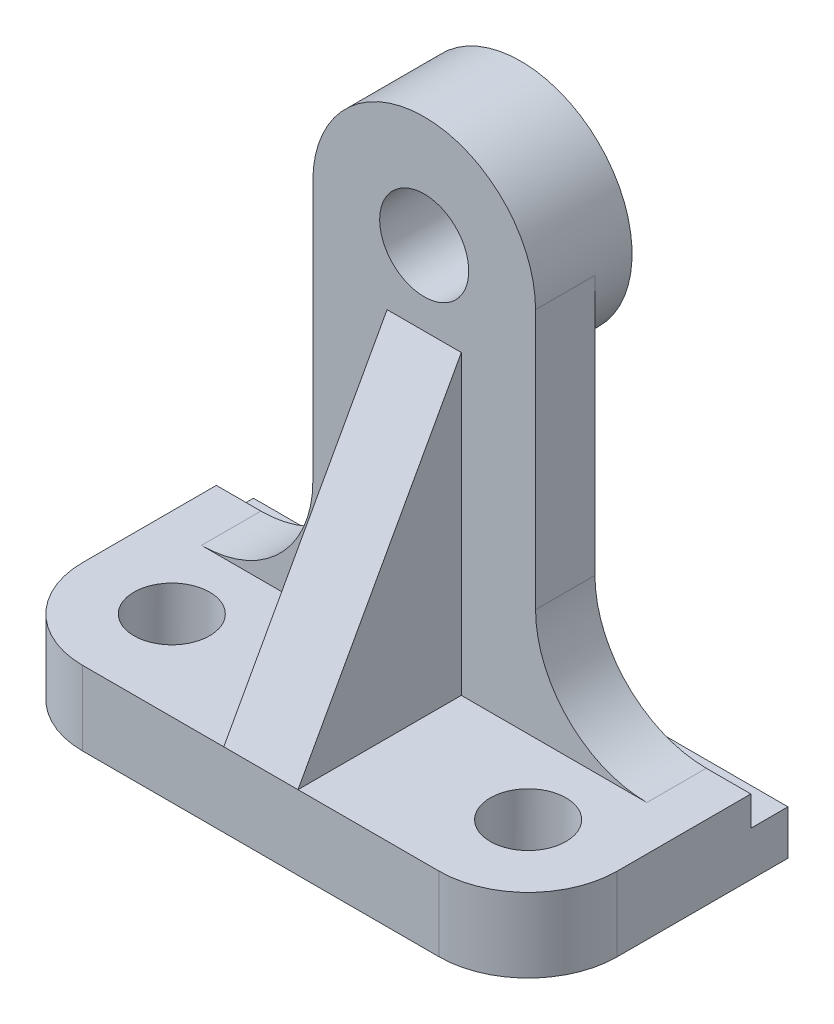
ISO-10303-21;
HEADER;
FILE_DESCRIPTION(('STEP AP214'),'2;1');
FILE_NAME('part.step','',(''),(''),'','','');
FILE_SCHEMA(('AUTOMOTIVE_DESIGN { 1 0 10303 214 1 1 1 1 }'));
ENDSEC;
DATA;
#1=APPLICATION_CONTEXT('core data for automotive mechanical design processes');
#2=APPLICATION_PROTOCOL_DEFINITION('international standard','automotive_design',2000,#1);
#3=PRODUCT_CONTEXT('',#1,'mechanical');
#4=PRODUCT('Part','Part','',(#3));
#5=PRODUCT_RELATED_PRODUCT_CATEGORY('part','',(#4));
#6=PRODUCT_DEFINITION_FORMATION('','',#4);
#7=PRODUCT_DEFINITION_CONTEXT('part definition',#1,'design');
#8=PRODUCT_DEFINITION('design','',#6,#7);
#9=PRODUCT_DEFINITION_SHAPE('','',#8);
#10=(LENGTH_UNIT() NAMED_UNIT(*) SI_UNIT(.MILLI.,.METRE.));
#11=(NAMED_UNIT(*) PLANE_ANGLE_UNIT() SI_UNIT($,.RADIAN.));
#12=(NAMED_UNIT(*) SI_UNIT($,.STERADIAN.) SOLID_ANGLE_UNIT());
#13=UNCERTAINTY_MEASURE_WITH_UNIT(LENGTH_MEASURE(1.E-05),#10,'distance_accuracy_value','');
#14=(GEOMETRIC_REPRESENTATION_CONTEXT(3) GLOBAL_UNCERTAINTY_ASSIGNED_CONTEXT((#13)) GLOBAL_UNIT_ASSIGNED_CONTEXT((#10,
#11,#12)) REPRESENTATION_CONTEXT('',''));
#15=CARTESIAN_POINT('',(0.,0.,0.));
#16=DIRECTION('',(0.,0.,1.));
#17=DIRECTION('',(1.,0.,0.));
#18=AXIS2_PLACEMENT_3D('',#15,#16,#17);
#19=CARTESIAN_POINT('',(-24.,10.,5.50000000000001));
#20=DIRECTION('',(0.,-1.,0.));
#21=DIRECTION('',(0.,0.,-1.));
#22=AXIS2_PLACEMENT_3D('',#19,#20,#21);
#23=PLANE('',#22);
#24=CARTESIAN_POINT('',(-24.,10.,5.50000000000001));
#25=DIRECTION('',(0.,1.,0.));
#26=DIRECTION('',(0.,0.,1.));
#27=AXIS2_PLACEMENT_3D('',#24,#25,#26);
#28=CIRCLE('',#27,5.09999999999999);
#29=CARTESIAN_POINT('',(-24.,10.,10.6));
#30=VERTEX_POINT('',#29);
#31=EDGE_CURVE('E371',#30,#30,#28,.T.);
#32=ORIENTED_EDGE('',*,*,#31,.F.);
#33=EDGE_LOOP('',(#32));
#34=FACE_BOUND('',#33,.T.);
#35=DIRECTION('',(0.,0.,1.));
#36=VECTOR('',#35,1.);
#37=CARTESIAN_POINT('',(-5.,10.,5.50000000000001));
#38=LINE('',#37,#36);
#39=CARTESIAN_POINT('',(-5.,10.,-4.5));
#40=VERTEX_POINT('',#39);
#41=CARTESIAN_POINT('',(-5.,10.,17.5));
#42=VERTEX_POINT('',#41);
#43=EDGE_CURVE('E186',#40,#42,#38,.T.);
#44=ORIENTED_EDGE('',*,*,#43,.F.);
#45=DIRECTION('',(1.,0.,0.));
#46=VECTOR('',#45,1.);
#47=CARTESIAN_POINT('',(0.,10.,-4.5));
#48=LINE('',#47,#46);
#49=CARTESIAN_POINT('',(-30.,10.,-4.5));
#50=VERTEX_POINT('',#49);
#51=EDGE_CURVE('E169',#50,#40,#48,.T.);
#52=ORIENTED_EDGE('',*,*,#51,.F.);
#53=DIRECTION('',(0.,0.,-1.));
#54=VECTOR('',#53,1.);
#55=CARTESIAN_POINT('',(-30.,10.,-4.5));
#56=LINE('',#55,#54);
#57=CARTESIAN_POINT('',(-30.,10.,-12.5));
#58=VERTEX_POINT('',#57);
#59=EDGE_CURVE('E257',#50,#58,#56,.T.);
#60=ORIENTED_EDGE('',*,*,#59,.T.);
#61=DIRECTION('',(-1.,0.,0.));
#62=VECTOR('',#61,1.);
#63=CARTESIAN_POINT('',(36.,10.,-12.5));
#64=LINE('',#63,#62);
#65=CARTESIAN_POINT('',(-36.,10.,-12.5));
#66=VERTEX_POINT('',#65);
#67=EDGE_CURVE('E299',#58,#66,#64,.T.);
#68=ORIENTED_EDGE('',*,*,#67,.T.);
#69=DIRECTION('',(0.,0.,1.));
#70=VECTOR('',#69,1.);
#71=CARTESIAN_POINT('',(-36.,10.,5.49999999999992));
#72=LINE('',#71,#70);
#73=CARTESIAN_POINT('',(-36.,10.,5.49999999999992));
#74=VERTEX_POINT('',#73);
#75=EDGE_CURVE('E309',#66,#74,#72,.T.);
#76=ORIENTED_EDGE('',*,*,#75,.T.);
#77=CARTESIAN_POINT('',(-24.,10.,5.50000000000001));
#78=DIRECTION('',(0.,1.,0.));
#79=DIRECTION('',(0.,0.,-1.));
#80=AXIS2_PLACEMENT_3D('',#77,#78,#79);
#81=CIRCLE('',#80,12.);
#82=CARTESIAN_POINT('',(-23.9999999999999,10.,17.5));
#83=VERTEX_POINT('',#82);
#84=EDGE_CURVE('E313',#74,#83,#81,.T.);
#85=ORIENTED_EDGE('',*,*,#84,.T.);
#86=DIRECTION('',(1.,0.,0.));
#87=VECTOR('',#86,1.);
#88=CARTESIAN_POINT('',(-23.9999999999999,10.,17.5));
#89=LINE('',#88,#87);
#90=EDGE_CURVE('E187',#83,#42,#89,.T.);
#91=ORIENTED_EDGE('',*,*,#90,.T.);
#92=EDGE_LOOP('',(#44,#52,#60,#68,#76,#85,#91));
#93=FACE_BOUND('',#92,.T.);
#94=ADVANCED_FACE('F47',(#34,#93),#23,.F.);
#95=CARTESIAN_POINT('',(36.,10.,-12.5));
#96=DIRECTION('',(0.,0.,1.));
#97=DIRECTION('',(1.,0.,0.));
#98=AXIS2_PLACEMENT_3D('',#95,#96,#97);
#99=PLANE('',#98);
#100=DIRECTION('',(-1.,0.,0.));
#101=VECTOR('',#100,1.);
#102=CARTESIAN_POINT('',(36.,6.,-12.5));
#103=LINE('',#102,#101);
#104=CARTESIAN_POINT('',(36.,6.,-12.5));
#105=VERTEX_POINT('',#104);
#106=CARTESIAN_POINT('',(-36.,6.,-12.5));
#107=VERTEX_POINT('',#106);
#108=EDGE_CURVE('E300',#105,#107,#103,.T.);
#109=ORIENTED_EDGE('',*,*,#108,.T.);
#110=DIRECTION('',(0.,1.,0.));
#111=VECTOR('',#110,1.);
#112=CARTESIAN_POINT('',(-36.,10.,-12.5));
#113=LINE('',#112,#111);
#114=EDGE_CURVE('E284',#107,#66,#113,.T.);
#115=ORIENTED_EDGE('',*,*,#114,.T.);
#116=ORIENTED_EDGE('',*,*,#67,.F.);
#117=CARTESIAN_POINT('',(-30.,25.,-12.5));
#118=DIRECTION('',(0.,0.,-1.));
#119=DIRECTION('',(-1.,0.,0.));
#120=AXIS2_PLACEMENT_3D('',#117,#118,#119);
#121=CIRCLE('',#120,15.);
#122=CARTESIAN_POINT('',(-15.,25.,-12.5));
#123=VERTEX_POINT('',#122);
#124=EDGE_CURVE('E219',#123,#58,#121,.T.);
#125=ORIENTED_EDGE('',*,*,#124,.F.);
#126=DIRECTION('',(0.,-1.,0.));
#127=VECTOR('',#126,1.);
#128=CARTESIAN_POINT('',(-15.,0.,-12.5));
#129=LINE('',#128,#127);
#130=CARTESIAN_POINT('',(-15.,60.,-12.5));
#131=VERTEX_POINT('',#130);
#132=EDGE_CURVE('E247',#131,#123,#129,.T.);
#133=ORIENTED_EDGE('',*,*,#132,.F.);
#134=CARTESIAN_POINT('',(0.,60.,-12.5));
#135=DIRECTION('',(0.,0.,-1.));
#136=DIRECTION('',(-1.,0.,0.));
#137=AXIS2_PLACEMENT_3D('',#134,#135,#136);
#138=CIRCLE('',#137,15.);
#139=CARTESIAN_POINT('',(15.,60.,-12.5));
#140=VERTEX_POINT('',#139);
#141=EDGE_CURVE('E210',#140,#131,#138,.T.);
#142=ORIENTED_EDGE('',*,*,#141,.F.);
#143=DIRECTION('',(0.,-1.,0.));
#144=VECTOR('',#143,1.);
#145=CARTESIAN_POINT('',(15.,0.,-12.5));
#146=LINE('',#145,#144);
#147=CARTESIAN_POINT('',(15.,25.,-12.5));
#148=VERTEX_POINT('',#147);
#149=EDGE_CURVE('E250',#140,#148,#146,.T.);
#150=ORIENTED_EDGE('',*,*,#149,.T.);
#151=CARTESIAN_POINT('',(30.,25.,-12.5));
#152=DIRECTION('',(0.,0.,-1.));
#153=DIRECTION('',(-1.,0.,0.));
#154=AXIS2_PLACEMENT_3D('',#151,#152,#153);
#155=CIRCLE('',#154,15.);
#156=CARTESIAN_POINT('',(30.,10.,-12.5));
#157=VERTEX_POINT('',#156);
#158=EDGE_CURVE('E225',#148,#157,#155,.F.);
#159=ORIENTED_EDGE('',*,*,#158,.T.);
#160=CARTESIAN_POINT('',(36.,10.,-12.5));
#161=VERTEX_POINT('',#160);
#162=EDGE_CURVE('E295',#161,#157,#64,.T.);
#163=ORIENTED_EDGE('',*,*,#162,.F.);
#164=DIRECTION('',(0.,1.,0.));
#165=VECTOR('',#164,1.);
#166=CARTESIAN_POINT('',(36.,10.,-12.5));
#167=LINE('',#166,#165);
#168=EDGE_CURVE('E283',#105,#161,#167,.T.);
#169=ORIENTED_EDGE('',*,*,#168,.F.);
#170=EDGE_LOOP('',(#109,#115,#116,#125,#133,#142,#150,#159,#163,#169));
#171=FACE_BOUND('',#170,.T.);
#172=ADVANCED_FACE('F404',(#171),#99,.F.);
#173=CARTESIAN_POINT('',(36.,10.,5.49999999999992));
#174=DIRECTION('',(-1.,0.,0.));
#175=DIRECTION('',(0.,0.,1.));
#176=AXIS2_PLACEMENT_3D('',#173,#174,#175);
#177=PLANE('',#176);
#178=DIRECTION('',(0.,0.,1.));
#179=VECTOR('',#178,1.);
#180=CARTESIAN_POINT('',(36.,6.,-17.5));
#181=LINE('',#180,#179);
#182=CARTESIAN_POINT('',(36.,6.,-17.5));
#183=VERTEX_POINT('',#182);
#184=EDGE_CURVE('E279',#183,#105,#181,.T.);
#185=ORIENTED_EDGE('',*,*,#184,.T.);
#186=ORIENTED_EDGE('',*,*,#168,.T.);
#187=DIRECTION('',(0.,0.,-1.));
#188=VECTOR('',#187,1.);
#189=CARTESIAN_POINT('',(36.,10.,5.49999999999992));
#190=LINE('',#189,#188);
#191=CARTESIAN_POINT('',(36.,10.,5.49999999999992));
#192=VERTEX_POINT('',#191);
#193=EDGE_CURVE('E305',#192,#161,#190,.T.);
#194=ORIENTED_EDGE('',*,*,#193,.F.);
#195=DIRECTION('',(0.,-1.,0.));
#196=VECTOR('',#195,1.);
#197=CARTESIAN_POINT('',(36.,10.,5.49999999999992));
#198=LINE('',#197,#196);
#199=CARTESIAN_POINT('',(36.,0.,5.49999999999992));
#200=VERTEX_POINT('',#199);
#201=EDGE_CURVE('E322',#192,#200,#198,.T.);
#202=ORIENTED_EDGE('',*,*,#201,.T.);
#203=DIRECTION('',(0.,0.,-1.));
#204=VECTOR('',#203,1.);
#205=CARTESIAN_POINT('',(36.,0.,5.49999999999992));
#206=LINE('',#205,#204);
#207=CARTESIAN_POINT('',(36.,0.,-17.5));
#208=VERTEX_POINT('',#207);
#209=EDGE_CURVE('E298',#200,#208,#206,.T.);
#210=ORIENTED_EDGE('',*,*,#209,.T.);
#211=DIRECTION('',(0.,-1.,0.));
#212=VECTOR('',#211,1.);
#213=CARTESIAN_POINT('',(36.,10.,-17.5));
#214=LINE('',#213,#212);
#215=EDGE_CURVE('E11',#183,#208,#214,.T.);
#216=ORIENTED_EDGE('',*,*,#215,.F.);
#217=EDGE_LOOP('',(#185,#186,#194,#202,#210,#216));
#218=FACE_BOUND('',#217,.T.);
#219=ADVANCED_FACE('F49',(#218),#177,.F.);
#220=CARTESIAN_POINT('',(-36.,10.,-17.5));
#221=DIRECTION('',(0.,0.,1.));
#222=DIRECTION('',(1.,0.,0.));
#223=AXIS2_PLACEMENT_3D('',#220,#221,#222);
#224=PLANE('',#223);
#225=DIRECTION('',(-1.,0.,0.));
#226=VECTOR('',#225,1.);
#227=CARTESIAN_POINT('',(-36.,0.,-17.5));
#228=LINE('',#227,#226);
#229=CARTESIAN_POINT('',(-36.,0.,-17.5));
#230=VERTEX_POINT('',#229);
#231=EDGE_CURVE('E326',#208,#230,#228,.T.);
#232=ORIENTED_EDGE('',*,*,#231,.T.);
#233=DIRECTION('',(0.,-1.,0.));
#234=VECTOR('',#233,1.);
#235=CARTESIAN_POINT('',(-36.,10.,-17.5));
#236=LINE('',#235,#234);
#237=CARTESIAN_POINT('',(-36.,6.,-17.5));
#238=VERTEX_POINT('',#237);
#239=EDGE_CURVE('E57',#238,#230,#236,.T.);
#240=ORIENTED_EDGE('',*,*,#239,.F.);
#241=DIRECTION('',(-1.,0.,0.));
#242=VECTOR('',#241,1.);
#243=CARTESIAN_POINT('',(36.,6.,-17.5));
#244=LINE('',#243,#242);
#245=EDGE_CURVE('E288',#183,#238,#244,.T.);
#246=ORIENTED_EDGE('',*,*,#245,.F.);
#247=ORIENTED_EDGE('',*,*,#215,.T.);
#248=EDGE_LOOP('',(#232,#240,#246,#247));
#249=FACE_BOUND('',#248,.T.);
#250=ADVANCED_FACE('F439',(#249),#224,.F.);
#251=CARTESIAN_POINT('',(-36.,10.,5.49999999999992));
#252=DIRECTION('',(1.,0.,0.));
#253=DIRECTION('',(0.,0.,-1.));
#254=AXIS2_PLACEMENT_3D('',#251,#252,#253);
#255=PLANE('',#254);
#256=ORIENTED_EDGE('',*,*,#75,.F.);
#257=ORIENTED_EDGE('',*,*,#114,.F.);
#258=DIRECTION('',(0.,0.,1.));
#259=VECTOR('',#258,1.);
#260=CARTESIAN_POINT('',(-36.,6.,-17.5));
#261=LINE('',#260,#259);
#262=EDGE_CURVE('E260',#238,#107,#261,.T.);
#263=ORIENTED_EDGE('',*,*,#262,.F.);
#264=ORIENTED_EDGE('',*,*,#239,.T.);
#265=DIRECTION('',(0.,0.,1.));
#266=VECTOR('',#265,1.);
#267=CARTESIAN_POINT('',(-36.,0.,5.49999999999992));
#268=LINE('',#267,#266);
#269=CARTESIAN_POINT('',(-36.,0.,5.49999999999992));
#270=VERTEX_POINT('',#269);
#271=EDGE_CURVE('E329',#230,#270,#268,.T.);
#272=ORIENTED_EDGE('',*,*,#271,.T.);
#273=DIRECTION('',(0.,-1.,0.));
#274=VECTOR('',#273,1.);
#275=CARTESIAN_POINT('',(-36.,10.,5.49999999999992));
#276=LINE('',#275,#274);
#277=EDGE_CURVE('E351',#74,#270,#276,.T.);
#278=ORIENTED_EDGE('',*,*,#277,.F.);
#279=EDGE_LOOP('',(#256,#257,#263,#264,#272,#278));
#280=FACE_BOUND('',#279,.T.);
#281=ADVANCED_FACE('F426',(#280),#255,.F.);
#282=CARTESIAN_POINT('',(-24.,10.,5.50000000000001));
#283=DIRECTION('',(0.,-1.,0.));
#284=DIRECTION('',(0.,0.,-1.));
#285=AXIS2_PLACEMENT_3D('',#282,#283,#284);
#286=CYLINDRICAL_SURFACE('',#285,12.);
#287=CARTESIAN_POINT('',(-24.,0.,5.50000000000001));
#288=DIRECTION('',(0.,1.,0.));
#289=DIRECTION('',(0.,0.,-1.));
#290=AXIS2_PLACEMENT_3D('',#287,#288,#289);
#291=CIRCLE('',#290,12.);
#292=CARTESIAN_POINT('',(-23.9999999999999,0.,17.5));
#293=VERTEX_POINT('',#292);
#294=EDGE_CURVE('E332',#270,#293,#291,.T.);
#295=ORIENTED_EDGE('',*,*,#294,.T.);
#296=DIRECTION('',(0.,-1.,0.));
#297=VECTOR('',#296,1.);
#298=CARTESIAN_POINT('',(-23.9999999999999,10.,17.5));
#299=LINE('',#298,#297);
#300=EDGE_CURVE('E347',#83,#293,#299,.T.);
#301=ORIENTED_EDGE('',*,*,#300,.F.);
#302=ORIENTED_EDGE('',*,*,#84,.F.);
#303=ORIENTED_EDGE('',*,*,#277,.T.);
#304=EDGE_LOOP('',(#295,#301,#302,#303));
#305=FACE_BOUND('',#304,.T.);
#306=ADVANCED_FACE('F432',(#305),#286,.T.);
#307=CARTESIAN_POINT('',(-23.9999999999999,10.,17.5));
#308=DIRECTION('',(0.,0.,-1.));
#309=DIRECTION('',(-1.,0.,0.));
#310=AXIS2_PLACEMENT_3D('',#307,#308,#309);
#311=PLANE('',#310);
#312=CARTESIAN_POINT('',(5.,10.,17.5));
#313=VERTEX_POINT('',#312);
#314=CARTESIAN_POINT('',(23.9999999999999,10.,17.5));
#315=VERTEX_POINT('',#314);
#316=EDGE_CURVE('E316',#313,#315,#89,.T.);
#317=ORIENTED_EDGE('',*,*,#316,.F.);
#318=DIRECTION('',(1.,0.,0.));
#319=VECTOR('',#318,1.);
#320=CARTESIAN_POINT('',(-24.,10.,17.5));
#321=LINE('',#320,#319);
#322=EDGE_CURVE('E72',#313,#42,#321,.F.);
#323=ORIENTED_EDGE('',*,*,#322,.T.);
#324=ORIENTED_EDGE('',*,*,#90,.F.);
#325=ORIENTED_EDGE('',*,*,#300,.T.);
#326=DIRECTION('',(1.,0.,0.));
#327=VECTOR('',#326,1.);
#328=CARTESIAN_POINT('',(-23.9999999999999,0.,17.5));
#329=LINE('',#328,#327);
#330=CARTESIAN_POINT('',(23.9999999999999,0.,17.5));
#331=VERTEX_POINT('',#330);
#332=EDGE_CURVE('E335',#293,#331,#329,.T.);
#333=ORIENTED_EDGE('',*,*,#332,.T.);
#334=DIRECTION('',(0.,-1.,0.));
#335=VECTOR('',#334,1.);
#336=CARTESIAN_POINT('',(23.9999999999999,10.,17.5));
#337=LINE('',#336,#335);
#338=EDGE_CURVE('E343',#315,#331,#337,.T.);
#339=ORIENTED_EDGE('',*,*,#338,.F.);
#340=EDGE_LOOP('',(#317,#323,#324,#325,#333,#339));
#341=FACE_BOUND('',#340,.T.);
#342=ADVANCED_FACE('F391',(#341),#311,.F.);
#343=CARTESIAN_POINT('',(24.,10.,5.50000000000001));
#344=DIRECTION('',(0.,-1.,0.));
#345=DIRECTION('',(0.,0.,-1.));
#346=AXIS2_PLACEMENT_3D('',#343,#344,#345);
#347=CYLINDRICAL_SURFACE('',#346,12.);
#348=CARTESIAN_POINT('',(24.,0.,5.50000000000001));
#349=DIRECTION('',(0.,1.,0.));
#350=DIRECTION('',(0.,0.,1.));
#351=AXIS2_PLACEMENT_3D('',#348,#349,#350);
#352=CIRCLE('',#351,12.);
#353=EDGE_CURVE('E310',#331,#200,#352,.T.);
#354=ORIENTED_EDGE('',*,*,#353,.T.);
#355=ORIENTED_EDGE('',*,*,#201,.F.);
#356=CARTESIAN_POINT('',(24.,10.,5.50000000000001));
#357=DIRECTION('',(0.,1.,0.));
#358=DIRECTION('',(0.,0.,1.));
#359=AXIS2_PLACEMENT_3D('',#356,#357,#358);
#360=CIRCLE('',#359,12.);
#361=EDGE_CURVE('E319',#315,#192,#360,.T.);
#362=ORIENTED_EDGE('',*,*,#361,.F.);
#363=ORIENTED_EDGE('',*,*,#338,.T.);
#364=EDGE_LOOP('',(#354,#355,#362,#363));
#365=FACE_BOUND('',#364,.T.);
#366=ADVANCED_FACE('F395',(#365),#347,.T.);
#367=CARTESIAN_POINT('',(24.,10.,5.50000000000001));
#368=DIRECTION('',(0.,1.,0.));
#369=DIRECTION('',(0.,0.,1.));
#370=AXIS2_PLACEMENT_3D('',#367,#368,#369);
#371=CIRCLE('',#370,5.09999999999999);
#372=CARTESIAN_POINT('',(24.,10.,10.6));
#373=VERTEX_POINT('',#372);
#374=EDGE_CURVE('E360',#373,#373,#371,.T.);
#375=ORIENTED_EDGE('',*,*,#374,.F.);
#376=EDGE_LOOP('',(#375));
#377=FACE_BOUND('',#376,.T.);
#378=CARTESIAN_POINT('',(5.,10.,-4.5));
#379=VERTEX_POINT('',#378);
#380=CARTESIAN_POINT('',(30.,10.,-4.5));
#381=VERTEX_POINT('',#380);
#382=EDGE_CURVE('E183',#379,#381,#48,.T.);
#383=ORIENTED_EDGE('',*,*,#382,.F.);
#384=DIRECTION('',(0.,0.,1.));
#385=VECTOR('',#384,1.);
#386=CARTESIAN_POINT('',(5.,10.,5.50000000000001));
#387=LINE('',#386,#385);
#388=EDGE_CURVE('E65',#379,#313,#387,.T.);
#389=ORIENTED_EDGE('',*,*,#388,.T.);
#390=ORIENTED_EDGE('',*,*,#316,.T.);
#391=ORIENTED_EDGE('',*,*,#361,.T.);
#392=ORIENTED_EDGE('',*,*,#193,.T.);
#393=ORIENTED_EDGE('',*,*,#162,.T.);
#394=DIRECTION('',(0.,0.,-1.));
#395=VECTOR('',#394,1.);
#396=CARTESIAN_POINT('',(30.,10.,-4.5));
#397=LINE('',#396,#395);
#398=EDGE_CURVE('E261',#381,#157,#397,.T.);
#399=ORIENTED_EDGE('',*,*,#398,.F.);
#400=EDGE_LOOP('',(#383,#389,#390,#391,#392,#393,#399));
#401=FACE_BOUND('',#400,.T.);
#402=ADVANCED_FACE('F384',(#377,#401),#23,.F.);
#403=CARTESIAN_POINT('',(-24.,0.,5.50000000000001));
#404=DIRECTION('',(0.,-1.,0.));
#405=DIRECTION('',(0.,0.,-1.));
#406=AXIS2_PLACEMENT_3D('',#403,#404,#405);
#407=PLANE('',#406);
#408=CARTESIAN_POINT('',(-24.,0.,5.50000000000001));
#409=DIRECTION('',(0.,-1.,0.));
#410=DIRECTION('',(0.,0.,-1.));
#411=AXIS2_PLACEMENT_3D('',#408,#409,#410);
#412=CIRCLE('',#411,5.09999999999998);
#413=CARTESIAN_POINT('',(-24.,0.,0.400000000000022));
#414=VERTEX_POINT('',#413);
#415=EDGE_CURVE('E51',#414,#414,#412,.T.);
#416=ORIENTED_EDGE('',*,*,#415,.F.);
#417=EDGE_LOOP('',(#416));
#418=FACE_BOUND('',#417,.T.);
#419=CARTESIAN_POINT('',(24.,0.,5.50000000000001));
#420=DIRECTION('',(0.,-1.,0.));
#421=DIRECTION('',(0.,0.,-1.));
#422=AXIS2_PLACEMENT_3D('',#419,#420,#421);
#423=CIRCLE('',#422,5.09999999999998);
#424=CARTESIAN_POINT('',(24.,0.,0.400000000000022));
#425=VERTEX_POINT('',#424);
#426=EDGE_CURVE('E357',#425,#425,#423,.T.);
#427=ORIENTED_EDGE('',*,*,#426,.F.);
#428=EDGE_LOOP('',(#427));
#429=FACE_BOUND('',#428,.T.);
#430=ORIENTED_EDGE('',*,*,#353,.F.);
#431=ORIENTED_EDGE('',*,*,#332,.F.);
#432=ORIENTED_EDGE('',*,*,#294,.F.);
#433=ORIENTED_EDGE('',*,*,#271,.F.);
#434=ORIENTED_EDGE('',*,*,#231,.F.);
#435=ORIENTED_EDGE('',*,*,#209,.F.);
#436=EDGE_LOOP('',(#430,#431,#432,#433,#434,#435));
#437=FACE_BOUND('',#436,.T.);
#438=ADVANCED_FACE('F434',(#418,#429,#437),#407,.T.);
#439=CARTESIAN_POINT('',(36.,6.,-17.5));
#440=DIRECTION('',(0.,-1.,0.));
#441=DIRECTION('',(0.,0.,-1.));
#442=AXIS2_PLACEMENT_3D('',#439,#440,#441);
#443=PLANE('',#442);
#444=ORIENTED_EDGE('',*,*,#245,.T.);
#445=ORIENTED_EDGE('',*,*,#262,.T.);
#446=ORIENTED_EDGE('',*,*,#108,.F.);
#447=ORIENTED_EDGE('',*,*,#184,.F.);
#448=EDGE_LOOP('',(#444,#445,#446,#447));
#449=FACE_BOUND('',#448,.T.);
#450=ADVANCED_FACE('F442',(#449),#443,.F.);
#451=CARTESIAN_POINT('',(-30.,25.,-4.5));
#452=DIRECTION('',(0.,0.,-1.));
#453=DIRECTION('',(-1.,0.,0.));
#454=AXIS2_PLACEMENT_3D('',#451,#452,#453);
#455=CYLINDRICAL_SURFACE('',#454,15.);
#456=ORIENTED_EDGE('',*,*,#124,.T.);
#457=ORIENTED_EDGE('',*,*,#59,.F.);
#458=CARTESIAN_POINT('',(-30.,25.,-4.5));
#459=DIRECTION('',(0.,0.,-1.));
#460=DIRECTION('',(-1.,0.,0.));
#461=AXIS2_PLACEMENT_3D('',#458,#459,#460);
#462=CIRCLE('',#461,15.);
#463=CARTESIAN_POINT('',(-15.,25.,-4.5));
#464=VERTEX_POINT('',#463);
#465=EDGE_CURVE('E177',#464,#50,#462,.T.);
#466=ORIENTED_EDGE('',*,*,#465,.F.);
#467=DIRECTION('',(0.,0.,-1.));
#468=VECTOR('',#467,1.);
#469=CARTESIAN_POINT('',(-15.,25.,-4.5));
#470=LINE('',#469,#468);
#471=EDGE_CURVE('E243',#464,#123,#470,.T.);
#472=ORIENTED_EDGE('',*,*,#471,.T.);
#473=EDGE_LOOP('',(#456,#457,#466,#472));
#474=FACE_BOUND('',#473,.T.);
#475=ADVANCED_FACE('F420',(#474),#455,.F.);
#476=CARTESIAN_POINT('',(30.,25.,-4.5));
#477=DIRECTION('',(0.,0.,-1.));
#478=DIRECTION('',(-1.,0.,0.));
#479=AXIS2_PLACEMENT_3D('',#476,#477,#478);
#480=CYLINDRICAL_SURFACE('',#479,15.);
#481=ORIENTED_EDGE('',*,*,#158,.F.);
#482=DIRECTION('',(0.,0.,-1.));
#483=VECTOR('',#482,1.);
#484=CARTESIAN_POINT('',(15.,25.,-4.5));
#485=LINE('',#484,#483);
#486=CARTESIAN_POINT('',(15.,25.,-4.5));
#487=VERTEX_POINT('',#486);
#488=EDGE_CURVE('E265',#487,#148,#485,.T.);
#489=ORIENTED_EDGE('',*,*,#488,.F.);
#490=CARTESIAN_POINT('',(30.,25.,-4.5));
#491=DIRECTION('',(0.,0.,-1.));
#492=DIRECTION('',(-1.,0.,0.));
#493=AXIS2_PLACEMENT_3D('',#490,#491,#492);
#494=CIRCLE('',#493,15.);
#495=EDGE_CURVE('E236',#487,#381,#494,.F.);
#496=ORIENTED_EDGE('',*,*,#495,.T.);
#497=ORIENTED_EDGE('',*,*,#398,.T.);
#498=EDGE_LOOP('',(#481,#489,#496,#497));
#499=FACE_BOUND('',#498,.T.);
#500=ADVANCED_FACE('F403',(#499),#480,.F.);
#501=CARTESIAN_POINT('',(15.,0.,-4.5));
#502=DIRECTION('',(1.,0.,0.));
#503=DIRECTION('',(0.,1.,0.));
#504=AXIS2_PLACEMENT_3D('',#501,#502,#503);
#505=PLANE('',#504);
#506=ORIENTED_EDGE('',*,*,#149,.F.);
#507=DIRECTION('',(0.,0.,-1.));
#508=VECTOR('',#507,1.);
#509=CARTESIAN_POINT('',(15.,60.,-4.5));
#510=LINE('',#509,#508);
#511=CARTESIAN_POINT('',(15.,60.,-4.5));
#512=VERTEX_POINT('',#511);
#513=EDGE_CURVE('E268',#512,#140,#510,.T.);
#514=ORIENTED_EDGE('',*,*,#513,.F.);
#515=DIRECTION('',(0.,-1.,0.));
#516=VECTOR('',#515,1.);
#517=CARTESIAN_POINT('',(15.,0.,-4.5));
#518=LINE('',#517,#516);
#519=EDGE_CURVE('E232',#512,#487,#518,.T.);
#520=ORIENTED_EDGE('',*,*,#519,.T.);
#521=ORIENTED_EDGE('',*,*,#488,.T.);
#522=EDGE_LOOP('',(#506,#514,#520,#521));
#523=FACE_BOUND('',#522,.T.);
#524=ADVANCED_FACE('F408',(#523),#505,.T.);
#525=CARTESIAN_POINT('',(0.,60.,-4.5));
#526=DIRECTION('',(0.,0.,-1.));
#527=DIRECTION('',(-1.,0.,0.));
#528=AXIS2_PLACEMENT_3D('',#525,#526,#527);
#529=CYLINDRICAL_SURFACE('',#528,15.);
#530=ORIENTED_EDGE('',*,*,#141,.T.);
#531=DIRECTION('',(0.,0.,-1.));
#532=VECTOR('',#531,1.);
#533=CARTESIAN_POINT('',(-15.,60.,-4.5));
#534=LINE('',#533,#532);
#535=CARTESIAN_POINT('',(-15.,60.,-4.5));
#536=VERTEX_POINT('',#535);
#537=EDGE_CURVE('E272',#536,#131,#534,.T.);
#538=ORIENTED_EDGE('',*,*,#537,.F.);
#539=CARTESIAN_POINT('',(0.,60.,-4.5));
#540=DIRECTION('',(0.,0.,-1.));
#541=DIRECTION('',(-1.,0.,0.));
#542=AXIS2_PLACEMENT_3D('',#539,#540,#541);
#543=CIRCLE('',#542,15.);
#544=EDGE_CURVE('E228',#536,#512,#543,.T.);
#545=ORIENTED_EDGE('',*,*,#544,.T.);
#546=ORIENTED_EDGE('',*,*,#513,.T.);
#547=EDGE_LOOP('',(#530,#538,#545,#546));
#548=FACE_BOUND('',#547,.T.);
#549=CARTESIAN_POINT('',(0.,60.,-17.5));
#550=DIRECTION('',(0.,0.,-1.));
#551=DIRECTION('',(-1.,0.,0.));
#552=AXIS2_PLACEMENT_3D('',#549,#550,#551);
#553=CIRCLE('',#552,15.);
#554=CARTESIAN_POINT('',(-15.,60.,-17.5));
#555=VERTEX_POINT('',#554);
#556=EDGE_CURVE('E211',#555,#555,#553,.T.);
#557=ORIENTED_EDGE('',*,*,#556,.F.);
#558=EDGE_LOOP('',(#557));
#559=FACE_BOUND('',#558,.T.);
#560=ADVANCED_FACE('F411',(#548,#559),#529,.T.);
#561=CARTESIAN_POINT('',(-15.,0.,-4.5));
#562=DIRECTION('',(1.,0.,0.));
#563=DIRECTION('',(0.,1.,0.));
#564=AXIS2_PLACEMENT_3D('',#561,#562,#563);
#565=PLANE('',#564);
#566=ORIENTED_EDGE('',*,*,#132,.T.);
#567=ORIENTED_EDGE('',*,*,#471,.F.);
#568=DIRECTION('',(0.,-1.,0.));
#569=VECTOR('',#568,1.);
#570=CARTESIAN_POINT('',(-15.,0.,-4.5));
#571=LINE('',#570,#569);
#572=EDGE_CURVE('E224',#536,#464,#571,.T.);
#573=ORIENTED_EDGE('',*,*,#572,.F.);
#574=ORIENTED_EDGE('',*,*,#537,.T.);
#575=EDGE_LOOP('',(#566,#567,#573,#574));
#576=FACE_BOUND('',#575,.T.);
#577=ADVANCED_FACE('F417',(#576),#565,.F.);
#578=CARTESIAN_POINT('',(0.,60.,-4.5));
#579=DIRECTION('',(0.,0.,-1.));
#580=DIRECTION('',(-1.,0.,0.));
#581=AXIS2_PLACEMENT_3D('',#578,#579,#580);
#582=CYLINDRICAL_SURFACE('',#581,6.);
#583=CARTESIAN_POINT('',(0.,60.,-17.5));
#584=DIRECTION('',(0.,0.,-1.));
#585=DIRECTION('',(-1.,0.,0.));
#586=AXIS2_PLACEMENT_3D('',#583,#584,#585);
#587=CIRCLE('',#586,6.);
#588=CARTESIAN_POINT('',(-6.,60.,-17.5));
#589=VERTEX_POINT('',#588);
#590=EDGE_CURVE('E215',#589,#589,#587,.T.);
#591=ORIENTED_EDGE('',*,*,#590,.T.);
#592=EDGE_LOOP('',(#591));
#593=FACE_BOUND('',#592,.T.);
#594=CARTESIAN_POINT('',(0.,60.,-4.5));
#595=DIRECTION('',(0.,0.,-1.));
#596=DIRECTION('',(-1.,0.,0.));
#597=AXIS2_PLACEMENT_3D('',#594,#595,#596);
#598=CIRCLE('',#597,6.);
#599=CARTESIAN_POINT('',(-6.,60.,-4.5));
#600=VERTEX_POINT('',#599);
#601=EDGE_CURVE('E182',#600,#600,#598,.T.);
#602=ORIENTED_EDGE('',*,*,#601,.F.);
#603=EDGE_LOOP('',(#602));
#604=FACE_BOUND('',#603,.T.);
#605=ADVANCED_FACE('F530',(#593,#604),#582,.F.);
#606=CARTESIAN_POINT('',(0.,0.,-4.5));
#607=DIRECTION('',(0.,0.,-1.));
#608=DIRECTION('',(-1.,0.,0.));
#609=AXIS2_PLACEMENT_3D('',#606,#607,#608);
#610=PLANE('',#609);
#611=DIRECTION('',(-1.,0.,0.));
#612=VECTOR('',#611,1.);
#613=CARTESIAN_POINT('',(0.,50.,-4.5));
#614=LINE('',#613,#612);
#615=CARTESIAN_POINT('',(-5.,50.,-4.5));
#616=VERTEX_POINT('',#615);
#617=CARTESIAN_POINT('',(5.,50.,-4.5));
#618=VERTEX_POINT('',#617);
#619=EDGE_CURVE('E205',#616,#618,#614,.F.);
#620=ORIENTED_EDGE('',*,*,#619,.T.);
#621=DIRECTION('',(0.,-1.,0.));
#622=VECTOR('',#621,1.);
#623=CARTESIAN_POINT('',(5.,0.,-4.5));
#624=LINE('',#623,#622);
#625=EDGE_CURVE('E199',#618,#379,#624,.T.);
#626=ORIENTED_EDGE('',*,*,#625,.T.);
#627=ORIENTED_EDGE('',*,*,#382,.T.);
#628=ORIENTED_EDGE('',*,*,#495,.F.);
#629=ORIENTED_EDGE('',*,*,#519,.F.);
#630=ORIENTED_EDGE('',*,*,#544,.F.);
#631=ORIENTED_EDGE('',*,*,#572,.T.);
#632=ORIENTED_EDGE('',*,*,#465,.T.);
#633=ORIENTED_EDGE('',*,*,#51,.T.);
#634=DIRECTION('',(0.,-1.,0.));
#635=VECTOR('',#634,1.);
#636=CARTESIAN_POINT('',(-5.,0.,-4.5));
#637=LINE('',#636,#635);
#638=EDGE_CURVE('E174',#616,#40,#637,.T.);
#639=ORIENTED_EDGE('',*,*,#638,.F.);
#640=EDGE_LOOP('',(#620,#626,#627,#628,#629,#630,#631,#632,#633,#639));
#641=FACE_BOUND('',#640,.T.);
#642=ORIENTED_EDGE('',*,*,#601,.T.);
#643=EDGE_LOOP('',(#642));
#644=FACE_BOUND('',#643,.T.);
#645=ADVANCED_FACE('F171',(#641,#644),#610,.F.);
#646=CARTESIAN_POINT('',(0.,0.,-17.5));
#647=DIRECTION('',(0.,0.,-1.));
#648=DIRECTION('',(-1.,0.,0.));
#649=AXIS2_PLACEMENT_3D('',#646,#647,#648);
#650=PLANE('',#649);
#651=ORIENTED_EDGE('',*,*,#590,.F.);
#652=EDGE_LOOP('',(#651));
#653=FACE_BOUND('',#652,.T.);
#654=ORIENTED_EDGE('',*,*,#556,.T.);
#655=EDGE_LOOP('',(#654));
#656=FACE_BOUND('',#655,.T.);
#657=ADVANCED_FACE('F545',(#653,#656),#650,.T.);
#658=CARTESIAN_POINT('',(0.,10.,17.5));
#659=DIRECTION('',(0.,-0.481918749772156,-0.876215908676647));
#660=DIRECTION('',(0.,0.876215908676647,-0.481918749772156));
#661=AXIS2_PLACEMENT_3D('',#658,#659,#660);
#662=PLANE('',#661);
#663=ORIENTED_EDGE('',*,*,#322,.F.);
#664=DIRECTION('',(0.,0.876215908676647,-0.481918749772156));
#665=VECTOR('',#664,1.);
#666=CARTESIAN_POINT('',(5.,10.,17.5));
#667=LINE('',#666,#665);
#668=EDGE_CURVE('E192',#313,#618,#667,.T.);
#669=ORIENTED_EDGE('',*,*,#668,.T.);
#670=ORIENTED_EDGE('',*,*,#619,.F.);
#671=DIRECTION('',(0.,0.876215908676647,-0.481918749772156));
#672=VECTOR('',#671,1.);
#673=CARTESIAN_POINT('',(-5.,10.,17.5));
#674=LINE('',#673,#672);
#675=EDGE_CURVE('E195',#42,#616,#674,.T.);
#676=ORIENTED_EDGE('',*,*,#675,.F.);
#677=EDGE_LOOP('',(#663,#669,#670,#676));
#678=FACE_BOUND('',#677,.T.);
#679=ADVANCED_FACE('F378',(#678),#662,.F.);
#680=CARTESIAN_POINT('',(5.,37.5,0.));
#681=DIRECTION('',(1.,0.,0.));
#682=DIRECTION('',(0.,0.,-1.));
#683=AXIS2_PLACEMENT_3D('',#680,#681,#682);
#684=PLANE('',#683);
#685=ORIENTED_EDGE('',*,*,#625,.F.);
#686=ORIENTED_EDGE('',*,*,#668,.F.);
#687=ORIENTED_EDGE('',*,*,#388,.F.);
#688=EDGE_LOOP('',(#685,#686,#687));
#689=FACE_BOUND('',#688,.T.);
#690=ADVANCED_FACE('F381',(#689),#684,.T.);
#691=CARTESIAN_POINT('',(-5.,37.5,0.));
#692=DIRECTION('',(1.,0.,0.));
#693=DIRECTION('',(0.,0.,-1.));
#694=AXIS2_PLACEMENT_3D('',#691,#692,#693);
#695=PLANE('',#694);
#696=ORIENTED_EDGE('',*,*,#675,.T.);
#697=ORIENTED_EDGE('',*,*,#638,.T.);
#698=ORIENTED_EDGE('',*,*,#43,.T.);
#699=EDGE_LOOP('',(#696,#697,#698));
#700=FACE_BOUND('',#699,.T.);
#701=ADVANCED_FACE('F194',(#700),#695,.F.);
#702=CARTESIAN_POINT('',(24.,10.,5.50000000000001));
#703=DIRECTION('',(0.,1.,0.));
#704=DIRECTION('',(0.,0.,1.));
#705=AXIS2_PLACEMENT_3D('',#702,#703,#704);
#706=CYLINDRICAL_SURFACE('',#705,5.09999999999998);
#707=ORIENTED_EDGE('',*,*,#426,.T.);
#708=EDGE_LOOP('',(#707));
#709=FACE_BOUND('',#708,.T.);
#710=ORIENTED_EDGE('',*,*,#374,.T.);
#711=EDGE_LOOP('',(#710));
#712=FACE_BOUND('',#711,.T.);
#713=ADVANCED_FACE('F583',(#709,#712),#706,.F.);
#714=CARTESIAN_POINT('',(-24.,10.,5.50000000000001));
#715=DIRECTION('',(0.,1.,0.));
#716=DIRECTION('',(0.,0.,1.));
#717=AXIS2_PLACEMENT_3D('',#714,#715,#716);
#718=CYLINDRICAL_SURFACE('',#717,5.09999999999998);
#719=ORIENTED_EDGE('',*,*,#415,.T.);
#720=EDGE_LOOP('',(#719));
#721=FACE_BOUND('',#720,.T.);
#722=ORIENTED_EDGE('',*,*,#31,.T.);
#723=EDGE_LOOP('',(#722));
#724=FACE_BOUND('',#723,.T.);
#725=ADVANCED_FACE('F616',(#721,#724),#718,.F.);
#726=CLOSED_SHELL('',(#94,#172,#219,#250,#281,#306,#342,#366,#402,#438,#450,#475,#500,#524,#560,
#577,#605,#645,#657,#679,#690,#701,#713,#725));
#727=MANIFOLD_SOLID_BREP('B2',#726);
#728=ADVANCED_BREP_SHAPE_REPRESENTATION('',(#18,#727),#14);
#729=SHAPE_DEFINITION_REPRESENTATION(#9,#728);
ENDSEC;
END-ISO-10303-21;
